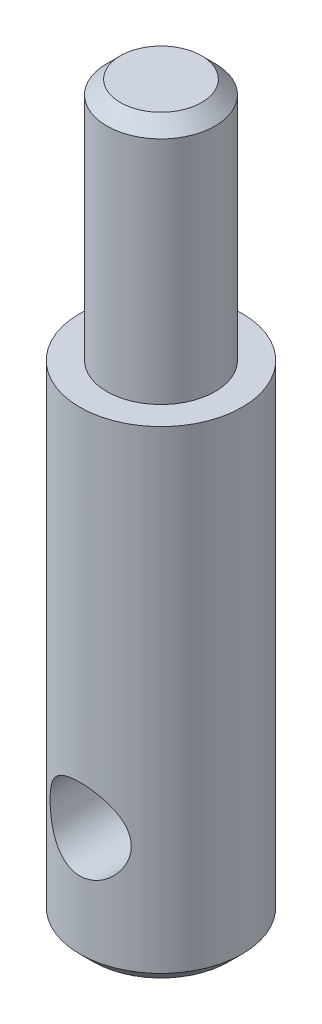
ISO-10303-21;
HEADER;
FILE_DESCRIPTION(('STEP AP214'),'2;1');
FILE_NAME('part.step','',(''),(''),'','','');
FILE_SCHEMA(('AUTOMOTIVE_DESIGN { 1 0 10303 214 1 1 1 1 }'));
ENDSEC;
DATA;
#1=APPLICATION_CONTEXT('core data for automotive mechanical design processes');
#2=APPLICATION_PROTOCOL_DEFINITION('international standard','automotive_design',2000,#1);
#3=PRODUCT_CONTEXT('',#1,'mechanical');
#4=PRODUCT('Part','Part','',(#3));
#5=PRODUCT_RELATED_PRODUCT_CATEGORY('part','',(#4));
#6=PRODUCT_DEFINITION_FORMATION('','',#4);
#7=PRODUCT_DEFINITION_CONTEXT('part definition',#1,'design');
#8=PRODUCT_DEFINITION('design','',#6,#7);
#9=PRODUCT_DEFINITION_SHAPE('','',#8);
#10=(LENGTH_UNIT() NAMED_UNIT(*) SI_UNIT(.MILLI.,.METRE.));
#11=(NAMED_UNIT(*) PLANE_ANGLE_UNIT() SI_UNIT($,.RADIAN.));
#12=(NAMED_UNIT(*) SI_UNIT($,.STERADIAN.) SOLID_ANGLE_UNIT());
#13=UNCERTAINTY_MEASURE_WITH_UNIT(LENGTH_MEASURE(1.E-05),#10,'distance_accuracy_value','');
#14=(GEOMETRIC_REPRESENTATION_CONTEXT(3) GLOBAL_UNCERTAINTY_ASSIGNED_CONTEXT((#13)) GLOBAL_UNIT_ASSIGNED_CONTEXT((#10,
#11,#12)) REPRESENTATION_CONTEXT('',''));
#15=CARTESIAN_POINT('',(0.,0.,0.));
#16=DIRECTION('',(0.,0.,1.));
#17=DIRECTION('',(1.,0.,0.));
#18=AXIS2_PLACEMENT_3D('',#15,#16,#17);
#19=CARTESIAN_POINT('',(0.,-36.,0.));
#20=DIRECTION('',(0.,1.,0.));
#21=DIRECTION('',(0.,0.,1.));
#22=AXIS2_PLACEMENT_3D('',#19,#20,#21);
#23=CYLINDRICAL_SURFACE('',#22,6.);
#24=CARTESIAN_POINT('',(0.,-35.,0.));
#25=DIRECTION('',(0.,1.,0.));
#26=DIRECTION('',(0.,0.,1.));
#27=AXIS2_PLACEMENT_3D('',#24,#25,#26);
#28=CIRCLE('',#27,6.);
#29=CARTESIAN_POINT('',(0.,-35.,6.));
#30=VERTEX_POINT('',#29);
#31=EDGE_CURVE('E59',#30,#30,#28,.T.);
#32=ORIENTED_EDGE('',*,*,#31,.T.);
#33=EDGE_LOOP('',(#32));
#34=FACE_BOUND('',#33,.T.);
#35=CARTESIAN_POINT('',(0.,-30.,6.));
#36=CARTESIAN_POINT('',(0.0788941476270899,-29.9999991612595,5.99999934964153));
#37=CARTESIAN_POINT('',(0.15779662040795,-29.9968820545245,5.99843869002385));
#38=CARTESIAN_POINT('',(0.315001991255922,-29.98446072826,5.99224358793258));
#39=CARTESIAN_POINT('',(0.393304603620535,-29.9751537259346,5.98760776295702));
#40=CARTESIAN_POINT('',(0.626628691373742,-29.9380421431814,5.96921978027472));
#41=CARTESIAN_POINT('',(0.779952894844981,-29.9010471709373,5.95098734455496));
#42=CARTESIAN_POINT('',(1.07683586335997,-29.8044182255708,5.90448966743082));
#43=CARTESIAN_POINT('',(1.22043005484385,-29.7448722337916,5.87626344365679));
#44=CARTESIAN_POINT('',(1.49540820515375,-29.6052887493211,5.81237302716333));
#45=CARTESIAN_POINT('',(1.62679312559149,-29.5252528722967,5.77670942093694));
#46=CARTESIAN_POINT('',(1.88252701271777,-29.3414460191505,5.69868752298932));
#47=CARTESIAN_POINT('',(2.0059694541685,-29.2365320524786,5.65605474586614));
#48=CARTESIAN_POINT('',(2.23433451090185,-29.0084440785134,5.56980033629331));
#49=CARTESIAN_POINT('',(2.33924301355731,-28.8852562868347,5.5261779786051));
#50=CARTESIAN_POINT('',(2.53576864722249,-28.6125156399182,5.43896347969577));
#51=CARTESIAN_POINT('',(2.62572411176601,-28.4616590255418,5.39563602686729));
#52=CARTESIAN_POINT('',(2.7403403145029,-28.2240491459768,5.33782449719395));
#53=CARTESIAN_POINT('',(2.77516786882117,-28.1429290754373,5.31974570840246));
#54=CARTESIAN_POINT('',(2.83769299596485,-27.9773994201195,5.28665768365287));
#55=CARTESIAN_POINT('',(2.86539478083936,-27.8929918127424,5.27164663543394));
#56=CARTESIAN_POINT('',(2.91188280266506,-27.7266042032378,5.24610341708083));
#57=CARTESIAN_POINT('',(2.93110042292907,-27.6447772032435,5.23535838565202));
#58=CARTESIAN_POINT('',(2.9626355938468,-27.4794450914804,5.21757784151145));
#59=CARTESIAN_POINT('',(2.97495680535109,-27.3959408944593,5.21054036082126));
#60=CARTESIAN_POINT('',(2.99251382412705,-27.2279936325838,5.20047756645272));
#61=CARTESIAN_POINT('',(2.99775389857938,-27.1435511641063,5.19744983647106));
#62=CARTESIAN_POINT('',(3.00108452416055,-26.9745063456586,5.19552555967191));
#63=CARTESIAN_POINT('',(2.9991757574161,-26.8899040117121,5.19662861870362));
#64=CARTESIAN_POINT('',(2.98404973540404,-26.6572461016777,5.20534668059274));
#65=CARTESIAN_POINT('',(2.96335042632723,-26.5097558458456,5.21726794353739));
#66=CARTESIAN_POINT('',(2.90082280036694,-26.2208063231749,5.25228182412118));
#67=CARTESIAN_POINT('',(2.85898775295595,-26.0793489930494,5.2753780002338));
#68=CARTESIAN_POINT('',(2.75462843937304,-25.8023203497032,5.33062568888728));
#69=CARTESIAN_POINT('',(2.69164495870316,-25.6669628882489,5.36297559567996));
#70=CARTESIAN_POINT('',(2.54712530575799,-25.408095036686,5.43310175251307));
#71=CARTESIAN_POINT('',(2.46558080007523,-25.2845900035195,5.47088043711311));
#72=CARTESIAN_POINT('',(2.27419808739746,-25.0364369062202,5.55339485686877));
#73=CARTESIAN_POINT('',(2.16208335434885,-24.9136295576159,5.59840533924979));
#74=CARTESIAN_POINT('',(1.91866675699301,-24.6877935657979,5.6864286668495));
#75=CARTESIAN_POINT('',(1.78735577540358,-24.5847743750941,5.72944054996685));
#76=CARTESIAN_POINT('',(1.50154951155101,-24.3969430679814,5.81105962769461));
#77=CARTESIAN_POINT('',(1.3462607732106,-24.3131985963024,5.84936952731879));
#78=CARTESIAN_POINT('',(1.02139864805275,-24.1737088992422,5.91473643118065));
#79=CARTESIAN_POINT('',(0.851836729203678,-24.1179414414503,5.94180236767508));
#80=CARTESIAN_POINT('',(0.518299474608028,-24.0405737920639,5.97973001282228));
#81=CARTESIAN_POINT('',(0.35502459154511,-24.0165262936183,5.99174814919366));
#82=CARTESIAN_POINT('',(0.0263387999478688,-23.9956058057383,6.00219040361882));
#83=CARTESIAN_POINT('',(-0.139071059584273,-23.9987199428605,6.00062096160122));
#84=CARTESIAN_POINT('',(-0.453698915981448,-24.0306200654602,5.98473576763842));
#85=CARTESIAN_POINT('',(-0.603178224155143,-24.0573975982439,5.97141737064974));
#86=CARTESIAN_POINT('',(-0.895220676900476,-24.1327142156314,5.93466513944052));
#87=CARTESIAN_POINT('',(-1.03778305707535,-24.1812556993486,5.91123019004896));
#88=CARTESIAN_POINT('',(-1.31666582534657,-24.2999953993113,5.85552754239055));
#89=CARTESIAN_POINT('',(-1.45269119100304,-24.3707731503413,5.82302645301465));
#90=CARTESIAN_POINT('',(-1.71138408511219,-24.5313226069473,5.75231922959683));
#91=CARTESIAN_POINT('',(-1.83404588938514,-24.6211024038287,5.71411066728832));
#92=CARTESIAN_POINT('',(-2.07530306780485,-24.8272812759437,5.63124663977895));
#93=CARTESIAN_POINT('',(-2.19231623321556,-24.9454286051448,5.58632654410486));
#94=CARTESIAN_POINT('',(-2.40556896301298,-25.1997754536848,5.49787174706804));
#95=CARTESIAN_POINT('',(-2.50179415686851,-25.3359873565804,5.4543380217028));
#96=CARTESIAN_POINT('',(-2.675123743717,-25.6309309624803,5.37153576650779));
#97=CARTESIAN_POINT('',(-2.75107648817021,-25.7904337979626,5.33257588763925));
#98=CARTESIAN_POINT('',(-2.87424847703564,-26.1225302030454,5.26722216885657));
#99=CARTESIAN_POINT('',(-2.92150474480838,-26.2951065806432,5.24081214709482));
#100=CARTESIAN_POINT('',(-2.98158506492521,-26.6307306675309,5.2068450303742));
#101=CARTESIAN_POINT('',(-2.997278998202,-26.7931027562903,5.19772150245585));
#102=CARTESIAN_POINT('',(-3.00206745414686,-27.1183412055073,5.19496064074354));
#103=CARTESIAN_POINT('',(-2.99117350647291,-27.2812073211427,5.20131659437267));
#104=CARTESIAN_POINT('',(-2.94577840699522,-27.5864504910934,5.22713585648299));
#105=CARTESIAN_POINT('',(-2.91362505078137,-27.7293013622656,5.24529281646867));
#106=CARTESIAN_POINT('',(-2.82952596688629,-28.0074244064572,5.29113050364645));
#107=CARTESIAN_POINT('',(-2.77757387249735,-28.142694125528,5.3188142941166));
#108=CARTESIAN_POINT('',(-2.65144766382428,-28.4118743616646,5.38285583940632));
#109=CARTESIAN_POINT('',(-2.57601505988082,-28.5450829694789,5.41967139666624));
#110=CARTESIAN_POINT('',(-2.40645126762009,-28.7978243449357,5.49706022440067));
#111=CARTESIAN_POINT('',(-2.31231035120759,-28.9173499464044,5.53763544397051));
#112=CARTESIAN_POINT('',(-2.094616891292,-29.1544228574881,5.62386853947507));
#113=CARTESIAN_POINT('',(-1.96888052183389,-29.2699651241614,5.66954494371953));
#114=CARTESIAN_POINT('',(-1.69843715077041,-29.478801140071,5.75633712356327));
#115=CARTESIAN_POINT('',(-1.55371998850183,-29.5720828970222,5.79745043456127));
#116=CARTESIAN_POINT('',(-1.32452333533412,-29.6931781845566,5.85251406841986));
#117=CARTESIAN_POINT('',(-1.24575314775787,-29.7305202002416,5.86982524242744));
#118=CARTESIAN_POINT('',(-1.08479725492719,-29.7983616788238,5.90168845962536));
#119=CARTESIAN_POINT('',(-1.00261324805381,-29.8288644970335,5.91624185523758));
#120=CARTESIAN_POINT('',(-0.835616997915667,-29.8826072559925,5.94212690185115));
#121=CARTESIAN_POINT('',(-0.750810940130689,-29.905863040764,5.95346557615479));
#122=CARTESIAN_POINT('',(-0.579142357408358,-29.9448825727806,5.97260771878739));
#123=CARTESIAN_POINT('',(-0.492281122825512,-29.9606508965564,5.98041334646939));
#124=CARTESIAN_POINT('',(-0.337824895315465,-29.9816846786135,5.99085829855372));
#125=CARTESIAN_POINT('',(-0.270495162095332,-29.988546917726,5.99428035414515));
#126=CARTESIAN_POINT('',(-0.135445671381782,-29.9977050014431,5.99885151538357));
#127=CARTESIAN_POINT('',(-0.0677259031748633,-30.0000007200085,6.00000055829382));
#128=CARTESIAN_POINT('',(0.,-30.,6.));
#129=B_SPLINE_CURVE_WITH_KNOTS('',3,(#35,#36,#37,#38,#39,#40,#41,#42,#43,#44,#45,#46,#47,#48,
#49,#50,#51,#52,#53,#54,#55,#56,#57,#58,#59,#60,#61,#62,#63,#64,#65,#66,#67,#68,#69,#70,#71,#72,
#73,#74,#75,#76,#77,#78,#79,#80,#81,#82,#83,#84,#85,#86,#87,#88,#89,#90,#91,#92,#93,#94,#95,#96,
#97,#98,#99,#100,#101,#102,#103,#104,#105,#106,#107,#108,#109,#110,#111,#112,#113,#114,#115,
#116,#117,#118,#119,#120,#121,#122,#123,#124,#125,#126,#127,#128),.UNSPECIFIED.,.T.,.F.,(4,2,2,
2,2,2,2,2,2,2,2,2,2,2,2,2,2,2,2,2,2,2,2,2,2,2,2,2,2,2,2,2,2,2,2,2,2,2,2,2,2,2,2,2,2,2,4),(0.,
0.236611432443576,0.473329310437701,0.947100987304416,1.41904300465372,1.89094781992153,
2.39140181433109,2.89223525113893,3.4319083310994,3.70192714967837,3.97178599119154,
4.22563720033309,4.47935352842581,4.73291689564223,4.98645606901568,5.43238672147391,
5.87845946700878,6.33492255429304,6.79159098704508,7.30616358925478,7.82098138719902,
8.35970601567165,8.89800185660682,9.3917140633788,9.88519228458271,10.3404225444221,
10.7957029981664,11.2640010300754,11.7324988716886,12.2470036685629,12.7618630076938,
13.3016558140826,13.8407507075944,14.3280945743223,14.8152271451712,15.2559532566965,
15.6968212128814,16.1673090526395,16.6380421835398,17.1659726319345,17.6941868506379,
17.9605054214138,18.2266930489272,18.4922945660822,18.7577335310501,18.9608446764332,
19.1639614277476),.UNSPECIFIED.);
#130=CARTESIAN_POINT('',(0.,-30.,6.));
#131=VERTEX_POINT('',#130);
#132=EDGE_CURVE('E67',#131,#131,#129,.T.);
#133=ORIENTED_EDGE('',*,*,#132,.F.);
#134=EDGE_LOOP('',(#133));
#135=FACE_BOUND('',#134,.T.);
#136=CARTESIAN_POINT('',(3.,-27.,-5.19615242270663));
#137=CARTESIAN_POINT('',(2.99999910875738,-27.0782002332591,-5.19615338151414));
#138=CARTESIAN_POINT('',(2.99693611207795,-27.1564099984646,-5.19792581191127));
#139=CARTESIAN_POINT('',(2.98473565374509,-27.312208075142,-5.20493931657123));
#140=CARTESIAN_POINT('',(2.97559536411629,-27.3897960802685,-5.21018200566082));
#141=CARTESIAN_POINT('',(2.9391691225804,-27.6209440142464,-5.23088200558207));
#142=CARTESIAN_POINT('',(2.902878058149,-27.7727509105333,-5.25131076607215));
#143=CARTESIAN_POINT('',(2.80829998089522,-28.0663916335235,-5.3024774692754));
#144=CARTESIAN_POINT('',(2.75012989346617,-28.2082738017509,-5.33316051577918));
#145=CARTESIAN_POINT('',(2.61380253964662,-28.4802627617008,-5.40128072966972));
#146=CARTESIAN_POINT('',(2.53564419197538,-28.6103689158749,-5.43871826241347));
#147=CARTESIAN_POINT('',(2.35399963256537,-28.8669201461477,-5.51990583559838));
#148=CARTESIAN_POINT('',(2.24895611137363,-28.9921782021559,-5.56392184571631));
#149=CARTESIAN_POINT('',(2.01976141989962,-29.2242243696895,-5.651159547025));
#150=CARTESIAN_POINT('',(1.89560077655245,-29.3310032682567,-5.69438083245621));
#151=CARTESIAN_POINT('',(1.62146869109162,-29.5301016877323,-5.77864428988887));
#152=CARTESIAN_POINT('',(1.47032156718994,-29.6209613659272,-5.81934318752246));
#153=CARTESIAN_POINT('',(1.15247107964639,-29.7754224974281,-5.89052268800541));
#154=CARTESIAN_POINT('',(0.985777614653091,-29.8390411532466,-5.92100973690811));
#155=CARTESIAN_POINT('',(0.654134831556284,-29.9325139979892,-5.96641383603058));
#156=CARTESIAN_POINT('',(0.489905370480167,-29.9644485796481,-5.98228440595573));
#157=CARTESIAN_POINT('',(0.157711887079232,-30.000498355444,-6.00022751605263));
#158=CARTESIAN_POINT('',(-0.0102498138110369,-30.0046303821323,-6.00230840492439));
#159=CARTESIAN_POINT('',(-0.329497576667919,-29.9857599673652,-5.9928894562274));
#160=CARTESIAN_POINT('',(-0.480963609704589,-29.9650859119219,-5.98255487247965));
#161=CARTESIAN_POINT('',(-0.77794130357984,-29.9013575098035,-5.9512273620779));
#162=CARTESIAN_POINT('',(-0.92345251797663,-29.8583014884221,-5.93023363786808));
#163=CARTESIAN_POINT('',(-1.20692822064062,-29.7507521442304,-5.87914748253372));
#164=CARTESIAN_POINT('',(-1.34476044303001,-29.6859704687994,-5.8489331854518));
#165=CARTESIAN_POINT('',(-1.60793023199368,-29.537210343292,-5.78212944004645));
#166=CARTESIAN_POINT('',(-1.73326330217191,-29.4532250204903,-5.74553771044373));
#167=CARTESIAN_POINT('',(-1.98052168794677,-29.2593115260605,-5.66533158492102));
#168=CARTESIAN_POINT('',(-2.10100497271934,-29.1476814893583,-5.62138031742825));
#169=CARTESIAN_POINT('',(-2.32231036115798,-28.9062402580911,-5.53363118085844));
#170=CARTESIAN_POINT('',(-2.42311733790258,-28.7764152061043,-5.48983345502612));
#171=CARTESIAN_POINT('',(-2.6085269546345,-28.4920178566593,-5.40432084665524));
#172=CARTESIAN_POINT('',(-2.691694028528,-28.336397564354,-5.36291485750667));
#173=CARTESIAN_POINT('',(-2.79542837524198,-28.0924369453882,-5.30915194408666));
#174=CARTESIAN_POINT('',(-2.82650797342002,-28.0093436895952,-5.2926194649543));
#175=CARTESIAN_POINT('',(-2.88131297532034,-27.8401913969656,-5.26298473463269));
#176=CARTESIAN_POINT('',(-2.90504291399185,-27.7541342255252,-5.24988036897854));
#177=CARTESIAN_POINT('',(-2.94323927983804,-27.586628379776,-5.22855455988393));
#178=CARTESIAN_POINT('',(-2.95828810706487,-27.5053505743622,-5.22002982263214));
#179=CARTESIAN_POINT('',(-2.98163903200842,-27.3415647613341,-5.2067273715729));
#180=CARTESIAN_POINT('',(-2.98994463830255,-27.2590574162517,-5.20194770920409));
#181=CARTESIAN_POINT('',(-2.99968663811345,-27.0935289931973,-5.19633662863607));
#182=CARTESIAN_POINT('',(-3.00112558946313,-27.0105081180563,-5.19550374026212));
#183=CARTESIAN_POINT('',(-2.99712742537403,-26.8447135392353,-5.19780953199967));
#184=CARTESIAN_POINT('',(-2.99169077406597,-26.7619398192495,-5.20094794403249));
#185=CARTESIAN_POINT('',(-2.96710135231213,-26.5331408639573,-5.21504493010247));
#186=CARTESIAN_POINT('',(-2.9405616310018,-26.3880891897367,-5.23019160660498));
#187=CARTESIAN_POINT('',(-2.8670906736223,-26.1048690892031,-5.27081666384497));
#188=CARTESIAN_POINT('',(-2.82015283383764,-25.9667029081698,-5.29629839028765));
#189=CARTESIAN_POINT('',(-2.70494224478443,-25.6937738960801,-5.35608780273032));
#190=CARTESIAN_POINT('',(-2.63578205088436,-25.5594650720959,-5.3907496041273));
#191=CARTESIAN_POINT('',(-2.47886133231339,-25.303590061634,-5.46468327792416));
#192=CARTESIAN_POINT('',(-2.39109125263821,-25.1820304691885,-5.50395751387985));
#193=CARTESIAN_POINT('',(-2.186511456958,-24.9390643733681,-5.58864005140301));
#194=CARTESIAN_POINT('',(-2.067435804994,-24.8196087291,-5.63419752084738));
#195=CARTESIAN_POINT('',(-1.8102134981498,-24.6017631047052,-5.72202702310923));
#196=CARTESIAN_POINT('',(-1.67206042712515,-24.5033802403245,-5.76429794308224));
#197=CARTESIAN_POINT('',(-1.3756060844338,-24.3282788724263,-5.84224085806641));
#198=CARTESIAN_POINT('',(-1.21686929217556,-24.2522006581169,-5.87770925226882));
#199=CARTESIAN_POINT('',(-0.886567094469556,-24.1285862756894,-5.93650064667294));
#200=CARTESIAN_POINT('',(-0.715013103124014,-24.081025045158,-5.95983430919533));
#201=CARTESIAN_POINT('',(-0.380939047947203,-24.0198943081509,-5.9900252464518));
#202=CARTESIAN_POINT('',(-0.219034335650397,-24.0036063644392,-5.99819783930701));
#203=CARTESIAN_POINT('',(0.105377961951194,-23.9974702115665,-6.00126390919338));
#204=CARTESIAN_POINT('',(0.267885316317455,-24.0076127468168,-5.99616203476054));
#205=CARTESIAN_POINT('',(0.577613962536136,-24.0522491901335,-5.97401907190636));
#206=CARTESIAN_POINT('',(0.72513690124772,-24.0850944376657,-5.95778686442443));
#207=CARTESIAN_POINT('',(1.0123379087444,-24.171981108032,-5.91576278551447));
#208=CARTESIAN_POINT('',(1.15201484923628,-24.2260255705425,-5.88996954319457));
#209=CARTESIAN_POINT('',(1.42627001605163,-24.3561807286887,-5.829778017116));
#210=CARTESIAN_POINT('',(1.56037465678411,-24.4331363415363,-5.79505887623288));
#211=CARTESIAN_POINT('',(1.81432469711302,-24.6058754214136,-5.7206436338201));
#212=CARTESIAN_POINT('',(1.93416350676913,-24.7016675359887,-5.68094524943991));
#213=CARTESIAN_POINT('',(2.16873884087781,-24.9203847224835,-5.59585978819439));
#214=CARTESIAN_POINT('',(2.28178066887875,-25.0450613207736,-5.55029975504518));
#215=CARTESIAN_POINT('',(2.48600225783028,-25.3123783280701,-5.46188649509677));
#216=CARTESIAN_POINT('',(2.57716267726705,-25.4550344610311,-5.41903568750872));
#217=CARTESIAN_POINT('',(2.69665559342489,-25.6825317933018,-5.36004774906989));
#218=CARTESIAN_POINT('',(2.73405408762355,-25.7619758009824,-5.34101219148464));
#219=CARTESIAN_POINT('',(2.80191257626505,-25.9243532830087,-5.30572783063718));
#220=CARTESIAN_POINT('',(2.83237614466583,-26.007284933748,-5.28947759301444));
#221=CARTESIAN_POINT('',(2.88592624586958,-26.1758447323697,-5.26045215868186));
#222=CARTESIAN_POINT('',(2.90903175649394,-26.2614653072414,-5.24766803509091));
#223=CARTESIAN_POINT('',(2.9476242805163,-26.4348552553143,-5.22608869625113));
#224=CARTESIAN_POINT('',(2.96311662049621,-26.5226230809206,-5.21729069243665));
#225=CARTESIAN_POINT('',(2.9830938122572,-26.6753988177599,-5.20588528016134));
#226=CARTESIAN_POINT('',(2.9894274622838,-26.740094808907,-5.20224442588138));
#227=CARTESIAN_POINT('',(2.99788106792141,-26.8698583167997,-5.19737751744686));
#228=CARTESIAN_POINT('',(3.00000074164547,-26.9349258581076,-5.1961516248372));
#229=CARTESIAN_POINT('',(3.,-27.,-5.19615242270663));
#230=B_SPLINE_CURVE_WITH_KNOTS('',3,(#136,#137,#138,#139,#140,#141,#142,#143,#144,#145,#146,
#147,#148,#149,#150,#151,#152,#153,#154,#155,#156,#157,#158,#159,#160,#161,#162,#163,#164,#165,
#166,#167,#168,#169,#170,#171,#172,#173,#174,#175,#176,#177,#178,#179,#180,#181,#182,#183,#184,
#185,#186,#187,#188,#189,#190,#191,#192,#193,#194,#195,#196,#197,#198,#199,#200,#201,#202,#203,
#204,#205,#206,#207,#208,#209,#210,#211,#212,#213,#214,#215,#216,#217,#218,#219,#220,#221,#222,
#223,#224,#225,#226,#227,#228,#229),.UNSPECIFIED.,.T.,.F.,(4,2,2,2,2,2,2,2,2,2,2,2,2,2,2,2,2,2,
2,2,2,2,2,2,2,2,2,2,2,2,2,2,2,2,2,2,2,2,2,2,2,2,2,2,2,2,4),(0.,0.23452943073389,
0.469168072604263,0.938850383294531,1.40605749261242,1.87328988121656,2.37905864237582,
2.88507883741225,3.42520847204402,3.96499651379785,4.46637625391917,4.96745241546232,
5.42495462941727,5.88249108040477,6.34635774681552,6.81039068538927,7.31828744858784,
7.82657315225867,8.36713695676457,8.63752916119814,8.90775419202328,9.15669600787593,
9.40550821320573,9.65422772860786,9.90293045534219,10.3454331624118,10.7880792327729,
11.2512265518736,11.7146122462924,12.2364099671094,12.7583836090371,13.29413310208,
13.8294110539541,14.3155757713756,14.8015702635101,15.2555404058358,15.7095756650514,
16.1830301812752,16.6567025627126,17.177514915193,17.6987859450456,17.9680115893229,
18.2370981707631,18.5054849980179,18.7736837791728,18.9688338446807,19.1639969639894),.UNSPECIFIED.);
#231=CARTESIAN_POINT('',(3.,-27.,-5.19615242270663));
#232=VERTEX_POINT('',#231);
#233=EDGE_CURVE('E76',#232,#232,#230,.T.);
#234=ORIENTED_EDGE('',*,*,#233,.F.);
#235=EDGE_LOOP('',(#234));
#236=FACE_BOUND('',#235,.T.);
#237=CARTESIAN_POINT('',(0.,0.,0.));
#238=DIRECTION('',(0.,1.,0.));
#239=DIRECTION('',(0.,0.,1.));
#240=AXIS2_PLACEMENT_3D('',#237,#238,#239);
#241=CIRCLE('',#240,6.);
#242=CARTESIAN_POINT('',(0.,0.,6.));
#243=VERTEX_POINT('',#242);
#244=EDGE_CURVE('E63',#243,#243,#241,.T.);
#245=ORIENTED_EDGE('',*,*,#244,.F.);
#246=EDGE_LOOP('',(#245));
#247=FACE_BOUND('',#246,.T.);
#248=ADVANCED_FACE('F51',(#34,#135,#236,#247),#23,.T.);
#249=CARTESIAN_POINT('',(0.,-36.,0.));
#250=DIRECTION('',(0.,1.,0.));
#251=DIRECTION('',(0.,0.,1.));
#252=AXIS2_PLACEMENT_3D('',#249,#250,#251);
#253=PLANE('',#252);
#254=CARTESIAN_POINT('',(0.,-36.,0.));
#255=DIRECTION('',(0.,1.,0.));
#256=DIRECTION('',(0.,0.,1.));
#257=AXIS2_PLACEMENT_3D('',#254,#255,#256);
#258=CIRCLE('',#257,4.99999999999999);
#259=CARTESIAN_POINT('',(0.,-36.,4.99999999999999));
#260=VERTEX_POINT('',#259);
#261=EDGE_CURVE('E11',#260,#260,#258,.F.);
#262=ORIENTED_EDGE('',*,*,#261,.T.);
#263=EDGE_LOOP('',(#262));
#264=FACE_BOUND('',#263,.T.);
#265=ADVANCED_FACE('F88',(#264),#253,.F.);
#266=CARTESIAN_POINT('',(0.,0.,0.));
#267=DIRECTION('',(0.,1.,0.));
#268=DIRECTION('',(0.,0.,1.));
#269=AXIS2_PLACEMENT_3D('',#266,#267,#268);
#270=PLANE('',#269);
#271=ORIENTED_EDGE('',*,*,#244,.T.);
#272=EDGE_LOOP('',(#271));
#273=FACE_BOUND('',#272,.T.);
#274=ADVANCED_FACE('F86',(#273),#270,.T.);
#275=CARTESIAN_POINT('',(0.,-27.,-18.));
#276=DIRECTION('',(0.,0.,1.));
#277=DIRECTION('',(1.,0.,0.));
#278=AXIS2_PLACEMENT_3D('',#275,#276,#277);
#279=CYLINDRICAL_SURFACE('',#278,3.);
#280=ORIENTED_EDGE('',*,*,#132,.T.);
#281=EDGE_LOOP('',(#280));
#282=FACE_BOUND('',#281,.T.);
#283=ORIENTED_EDGE('',*,*,#233,.T.);
#284=EDGE_LOOP('',(#283));
#285=FACE_BOUND('',#284,.T.);
#286=ADVANCED_FACE('F82',(#282,#285),#279,.F.);
#287=CARTESIAN_POINT('',(0.,-35.,0.));
#288=DIRECTION('',(0.,1.,0.));
#289=DIRECTION('',(0.,0.,1.));
#290=AXIS2_PLACEMENT_3D('',#287,#288,#289);
#291=CONICAL_SURFACE('',#290,6.,0.785398163397454);
#292=ORIENTED_EDGE('',*,*,#261,.F.);
#293=EDGE_LOOP('',(#292));
#294=FACE_BOUND('',#293,.T.);
#295=ORIENTED_EDGE('',*,*,#31,.F.);
#296=EDGE_LOOP('',(#295));
#297=FACE_BOUND('',#296,.T.);
#298=ADVANCED_FACE('F54',(#294,#297),#291,.T.);
#299=CLOSED_SHELL('',(#248,#265,#274,#286,#298));
#300=MANIFOLD_SOLID_BREP('B2',#299);
#301=CARTESIAN_POINT('',(0.,18.,0.));
#302=DIRECTION('',(0.,-1.,0.));
#303=DIRECTION('',(0.,0.,-1.));
#304=AXIS2_PLACEMENT_3D('',#301,#302,#303);
#305=CYLINDRICAL_SURFACE('',#304,4.);
#306=CARTESIAN_POINT('',(0.,17.,0.));
#307=DIRECTION('',(0.,1.,0.));
#308=DIRECTION('',(0.,0.,1.));
#309=AXIS2_PLACEMENT_3D('',#306,#307,#308);
#310=CIRCLE('',#309,4.);
#311=CARTESIAN_POINT('',(0.,17.,4.));
#312=VERTEX_POINT('',#311);
#313=EDGE_CURVE('E50',#312,#312,#310,.F.);
#314=ORIENTED_EDGE('',*,*,#313,.T.);
#315=EDGE_LOOP('',(#314));
#316=FACE_BOUND('',#315,.T.);
#317=CARTESIAN_POINT('',(0.,0.,0.));
#318=DIRECTION('',(0.,1.,0.));
#319=DIRECTION('',(0.,0.,1.));
#320=AXIS2_PLACEMENT_3D('',#317,#318,#319);
#321=CIRCLE('',#320,4.);
#322=CARTESIAN_POINT('',(0.,0.,4.));
#323=VERTEX_POINT('',#322);
#324=EDGE_CURVE('E153',#323,#323,#321,.T.);
#325=ORIENTED_EDGE('',*,*,#324,.T.);
#326=EDGE_LOOP('',(#325));
#327=FACE_BOUND('',#326,.T.);
#328=ADVANCED_FACE('F141',(#316,#327),#305,.T.);
#329=CARTESIAN_POINT('',(0.,18.,0.));
#330=DIRECTION('',(0.,1.,0.));
#331=DIRECTION('',(0.,0.,1.));
#332=AXIS2_PLACEMENT_3D('',#329,#330,#331);
#333=PLANE('',#332);
#334=CARTESIAN_POINT('',(0.,18.,0.));
#335=DIRECTION('',(0.,1.,0.));
#336=DIRECTION('',(0.,0.,1.));
#337=AXIS2_PLACEMENT_3D('',#334,#335,#336);
#338=CIRCLE('',#337,3.);
#339=CARTESIAN_POINT('',(0.,18.,3.));
#340=VERTEX_POINT('',#339);
#341=EDGE_CURVE('E149',#340,#340,#338,.T.);
#342=ORIENTED_EDGE('',*,*,#341,.T.);
#343=EDGE_LOOP('',(#342));
#344=FACE_BOUND('',#343,.T.);
#345=ADVANCED_FACE('F163',(#344),#333,.T.);
#346=CARTESIAN_POINT('',(0.,0.,0.));
#347=DIRECTION('',(0.,1.,0.));
#348=DIRECTION('',(0.,0.,1.));
#349=AXIS2_PLACEMENT_3D('',#346,#347,#348);
#350=PLANE('',#349);
#351=ORIENTED_EDGE('',*,*,#324,.F.);
#352=EDGE_LOOP('',(#351));
#353=FACE_BOUND('',#352,.T.);
#354=ADVANCED_FACE('F161',(#353),#350,.F.);
#355=CARTESIAN_POINT('',(0.,18.,0.));
#356=DIRECTION('',(0.,-1.,0.));
#357=DIRECTION('',(0.,0.,-1.));
#358=AXIS2_PLACEMENT_3D('',#355,#356,#357);
#359=CONICAL_SURFACE('',#358,3.,0.785398163397447);
#360=ORIENTED_EDGE('',*,*,#313,.F.);
#361=EDGE_LOOP('',(#360));
#362=FACE_BOUND('',#361,.T.);
#363=ORIENTED_EDGE('',*,*,#341,.F.);
#364=EDGE_LOOP('',(#363));
#365=FACE_BOUND('',#364,.T.);
#366=ADVANCED_FACE('F144',(#362,#365),#359,.T.);
#367=CLOSED_SHELL('',(#328,#345,#354,#366));
#368=MANIFOLD_SOLID_BREP('B6',#367);
#369=ADVANCED_BREP_SHAPE_REPRESENTATION('',(#18,#300,#368),#14);
#370=SHAPE_DEFINITION_REPRESENTATION(#9,#369);
ENDSEC;
END-ISO-10303-21;
